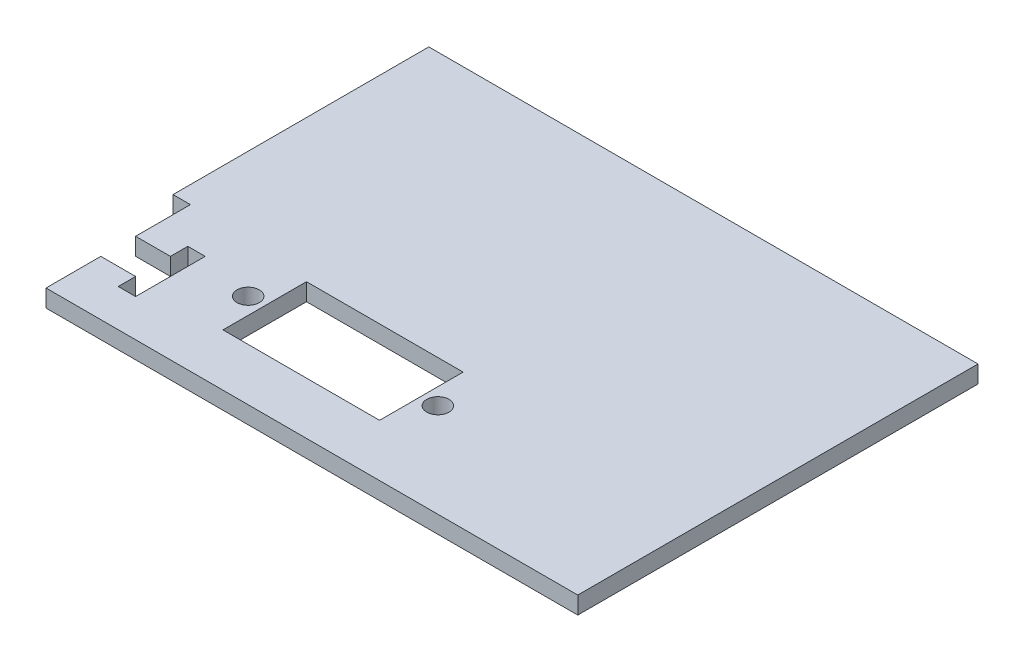
ISO-10303-21;
HEADER;
FILE_DESCRIPTION(('STEP AP214'),'2;1');
FILE_NAME('part.step','',(''),(''),'','','');
FILE_SCHEMA(('AUTOMOTIVE_DESIGN { 1 0 10303 214 1 1 1 1 }'));
ENDSEC;
DATA;
#1=APPLICATION_CONTEXT('core data for automotive mechanical design processes');
#2=APPLICATION_PROTOCOL_DEFINITION('international standard','automotive_design',2000,#1);
#3=PRODUCT_CONTEXT('',#1,'mechanical');
#4=PRODUCT('Part','Part','',(#3));
#5=PRODUCT_RELATED_PRODUCT_CATEGORY('part','',(#4));
#6=PRODUCT_DEFINITION_FORMATION('','',#4);
#7=PRODUCT_DEFINITION_CONTEXT('part definition',#1,'design');
#8=PRODUCT_DEFINITION('design','',#6,#7);
#9=PRODUCT_DEFINITION_SHAPE('','',#8);
#10=(LENGTH_UNIT() NAMED_UNIT(*) SI_UNIT(.MILLI.,.METRE.));
#11=(NAMED_UNIT(*) PLANE_ANGLE_UNIT() SI_UNIT($,.RADIAN.));
#12=(NAMED_UNIT(*) SI_UNIT($,.STERADIAN.) SOLID_ANGLE_UNIT());
#13=UNCERTAINTY_MEASURE_WITH_UNIT(LENGTH_MEASURE(1.E-05),#10,'distance_accuracy_value','');
#14=(GEOMETRIC_REPRESENTATION_CONTEXT(3) GLOBAL_UNCERTAINTY_ASSIGNED_CONTEXT((#13)) GLOBAL_UNIT_ASSIGNED_CONTEXT((#10,
#11,#12)) REPRESENTATION_CONTEXT('',''));
#15=CARTESIAN_POINT('',(0.,0.,0.));
#16=DIRECTION('',(0.,0.,1.));
#17=DIRECTION('',(1.,0.,0.));
#18=AXIS2_PLACEMENT_3D('',#15,#16,#17);
#19=CARTESIAN_POINT('',(0.,2.5,0.));
#20=DIRECTION('',(0.,-1.,0.));
#21=DIRECTION('',(0.,0.,-1.));
#22=AXIS2_PLACEMENT_3D('',#19,#20,#21);
#23=PLANE('',#22);
#24=DIRECTION('',(0.,0.,-1.));
#25=VECTOR('',#24,1.);
#26=CARTESIAN_POINT('',(-19.175,2.5,0.));
#27=LINE('',#26,#25);
#28=CARTESIAN_POINT('',(-19.175,2.5,32.125));
#29=VERTEX_POINT('',#28);
#30=CARTESIAN_POINT('',(-19.175,2.5,29.625));
#31=VERTEX_POINT('',#30);
#32=EDGE_CURVE('E288',#29,#31,#27,.T.);
#33=ORIENTED_EDGE('',*,*,#32,.T.);
#34=DIRECTION('',(1.,0.,0.));
#35=VECTOR('',#34,1.);
#36=CARTESIAN_POINT('',(0.,2.5,29.625));
#37=LINE('',#36,#35);
#38=CARTESIAN_POINT('',(-24.175,2.5,29.625));
#39=VERTEX_POINT('',#38);
#40=EDGE_CURVE('E291',#39,#31,#37,.T.);
#41=ORIENTED_EDGE('',*,*,#40,.F.);
#42=DIRECTION('',(0.,0.,-1.));
#43=VECTOR('',#42,1.);
#44=CARTESIAN_POINT('',(-24.175,2.5,37.5));
#45=LINE('',#44,#43);
#46=CARTESIAN_POINT('',(-24.175,2.5,37.5));
#47=VERTEX_POINT('',#46);
#48=EDGE_CURVE('E197',#47,#39,#45,.T.);
#49=ORIENTED_EDGE('',*,*,#48,.F.);
#50=DIRECTION('',(-1.,0.,0.));
#51=VECTOR('',#50,1.);
#52=CARTESIAN_POINT('',(-40.,2.5,37.5));
#53=LINE('',#52,#51);
#54=CARTESIAN_POINT('',(52.225,2.5,37.5));
#55=VERTEX_POINT('',#54);
#56=EDGE_CURVE('E201',#55,#47,#53,.T.);
#57=ORIENTED_EDGE('',*,*,#56,.F.);
#58=DIRECTION('',(0.,0.,1.));
#59=VECTOR('',#58,1.);
#60=CARTESIAN_POINT('',(52.225,2.5,-20.));
#61=LINE('',#60,#59);
#62=CARTESIAN_POINT('',(52.225,2.5,-20.));
#63=VERTEX_POINT('',#62);
#64=EDGE_CURVE('E331',#63,#55,#61,.T.);
#65=ORIENTED_EDGE('',*,*,#64,.F.);
#66=DIRECTION('',(1.,0.,0.));
#67=VECTOR('',#66,1.);
#68=CARTESIAN_POINT('',(-40.,2.5,-20.));
#69=LINE('',#68,#67);
#70=CARTESIAN_POINT('',(-26.675,2.5,-20.));
#71=VERTEX_POINT('',#70);
#72=EDGE_CURVE('E196',#71,#63,#69,.T.);
#73=ORIENTED_EDGE('',*,*,#72,.F.);
#74=DIRECTION('',(0.,0.,-1.));
#75=VECTOR('',#74,1.);
#76=CARTESIAN_POINT('',(-26.675,2.5,-20.));
#77=LINE('',#76,#75);
#78=CARTESIAN_POINT('',(-26.675,2.5,16.75));
#79=VERTEX_POINT('',#78);
#80=EDGE_CURVE('E187',#79,#71,#77,.T.);
#81=ORIENTED_EDGE('',*,*,#80,.F.);
#82=DIRECTION('',(-1.,0.,0.));
#83=VECTOR('',#82,1.);
#84=CARTESIAN_POINT('',(-24.175,2.5,16.75));
#85=LINE('',#84,#83);
#86=CARTESIAN_POINT('',(-24.175,2.5,16.75));
#87=VERTEX_POINT('',#86);
#88=EDGE_CURVE('E168',#87,#79,#85,.T.);
#89=ORIENTED_EDGE('',*,*,#88,.F.);
#90=CARTESIAN_POINT('',(-24.175,2.5,24.625));
#91=VERTEX_POINT('',#90);
#92=EDGE_CURVE('E189',#91,#87,#45,.T.);
#93=ORIENTED_EDGE('',*,*,#92,.F.);
#94=DIRECTION('',(1.,0.,0.));
#95=VECTOR('',#94,1.);
#96=CARTESIAN_POINT('',(0.,2.5,24.625));
#97=LINE('',#96,#95);
#98=CARTESIAN_POINT('',(-19.175,2.5,24.625));
#99=VERTEX_POINT('',#98);
#100=EDGE_CURVE('E312',#91,#99,#97,.T.);
#101=ORIENTED_EDGE('',*,*,#100,.T.);
#102=CARTESIAN_POINT('',(-19.175,2.5,22.125));
#103=VERTEX_POINT('',#102);
#104=EDGE_CURVE('E298',#99,#103,#27,.T.);
#105=ORIENTED_EDGE('',*,*,#104,.T.);
#106=DIRECTION('',(-1.,0.,0.));
#107=VECTOR('',#106,1.);
#108=CARTESIAN_POINT('',(0.,2.5,22.125));
#109=LINE('',#108,#107);
#110=CARTESIAN_POINT('',(-16.675,2.5,22.125));
#111=VERTEX_POINT('',#110);
#112=EDGE_CURVE('E357',#111,#103,#109,.T.);
#113=ORIENTED_EDGE('',*,*,#112,.F.);
#114=DIRECTION('',(0.,0.,-1.));
#115=VECTOR('',#114,1.);
#116=CARTESIAN_POINT('',(-16.675,2.5,0.));
#117=LINE('',#116,#115);
#118=CARTESIAN_POINT('',(-16.675,2.5,32.125));
#119=VERTEX_POINT('',#118);
#120=EDGE_CURVE('E361',#119,#111,#117,.T.);
#121=ORIENTED_EDGE('',*,*,#120,.F.);
#122=DIRECTION('',(1.,0.,0.));
#123=VECTOR('',#122,1.);
#124=CARTESIAN_POINT('',(0.,2.5,32.125));
#125=LINE('',#124,#123);
#126=EDGE_CURVE('E294',#29,#119,#125,.T.);
#127=ORIENTED_EDGE('',*,*,#126,.F.);
#128=EDGE_LOOP('',(#33,#41,#49,#57,#65,#73,#81,#89,#93,#101,#105,#113,#121,#127));
#129=FACE_BOUND('',#128,.T.);
#130=DIRECTION('',(-1.,0.,0.));
#131=VECTOR('',#130,1.);
#132=CARTESIAN_POINT('',(40.,2.5,30.));
#133=LINE('',#132,#131);
#134=CARTESIAN_POINT('',(16.25,2.5,30.));
#135=VERTEX_POINT('',#134);
#136=CARTESIAN_POINT('',(-6.24999999999999,2.5,30.));
#137=VERTEX_POINT('',#136);
#138=EDGE_CURVE('E206',#135,#137,#133,.T.);
#139=ORIENTED_EDGE('',*,*,#138,.T.);
#140=DIRECTION('',(0.,0.,-1.));
#141=VECTOR('',#140,1.);
#142=CARTESIAN_POINT('',(-6.24999999999999,2.5,0.));
#143=LINE('',#142,#141);
#144=CARTESIAN_POINT('',(-6.24999999999999,2.5,18.));
#145=VERTEX_POINT('',#144);
#146=EDGE_CURVE('E226',#137,#145,#143,.T.);
#147=ORIENTED_EDGE('',*,*,#146,.T.);
#148=DIRECTION('',(-1.,0.,0.));
#149=VECTOR('',#148,1.);
#150=CARTESIAN_POINT('',(0.,2.5,18.));
#151=LINE('',#150,#149);
#152=CARTESIAN_POINT('',(16.25,2.5,18.));
#153=VERTEX_POINT('',#152);
#154=EDGE_CURVE('E223',#153,#145,#151,.T.);
#155=ORIENTED_EDGE('',*,*,#154,.F.);
#156=DIRECTION('',(0.,0.,-1.));
#157=VECTOR('',#156,1.);
#158=CARTESIAN_POINT('',(16.25,2.5,0.));
#159=LINE('',#158,#157);
#160=EDGE_CURVE('E218',#135,#153,#159,.T.);
#161=ORIENTED_EDGE('',*,*,#160,.F.);
#162=EDGE_LOOP('',(#139,#147,#155,#161));
#163=FACE_BOUND('',#162,.T.);
#164=CARTESIAN_POINT('',(-8.625,2.5,24.));
#165=DIRECTION('',(0.,1.,0.));
#166=DIRECTION('',(0.,0.,1.));
#167=AXIS2_PLACEMENT_3D('',#164,#165,#166);
#168=CIRCLE('',#167,1.6);
#169=CARTESIAN_POINT('',(-8.625,2.5,25.6));
#170=VERTEX_POINT('',#169);
#171=EDGE_CURVE('E215',#170,#170,#168,.T.);
#172=ORIENTED_EDGE('',*,*,#171,.F.);
#173=EDGE_LOOP('',(#172));
#174=FACE_BOUND('',#173,.T.);
#175=CARTESIAN_POINT('',(18.625,2.5,24.));
#176=DIRECTION('',(0.,1.,0.));
#177=DIRECTION('',(0.,0.,1.));
#178=AXIS2_PLACEMENT_3D('',#175,#176,#177);
#179=CIRCLE('',#178,1.6);
#180=CARTESIAN_POINT('',(18.625,2.5,25.6));
#181=VERTEX_POINT('',#180);
#182=EDGE_CURVE('E214',#181,#181,#179,.T.);
#183=ORIENTED_EDGE('',*,*,#182,.F.);
#184=EDGE_LOOP('',(#183));
#185=FACE_BOUND('',#184,.T.);
#186=ADVANCED_FACE('F34',(#129,#163,#174,#185),#23,.F.);
#187=CARTESIAN_POINT('',(0.,0.,0.));
#188=DIRECTION('',(0.,-1.,0.));
#189=DIRECTION('',(0.,0.,-1.));
#190=AXIS2_PLACEMENT_3D('',#187,#188,#189);
#191=PLANE('',#190);
#192=DIRECTION('',(-1.,0.,0.));
#193=VECTOR('',#192,1.);
#194=CARTESIAN_POINT('',(-24.175,0.,16.75));
#195=LINE('',#194,#193);
#196=CARTESIAN_POINT('',(-24.175,0.,16.75));
#197=VERTEX_POINT('',#196);
#198=CARTESIAN_POINT('',(-26.675,0.,16.75));
#199=VERTEX_POINT('',#198);
#200=EDGE_CURVE('E165',#197,#199,#195,.T.);
#201=ORIENTED_EDGE('',*,*,#200,.T.);
#202=DIRECTION('',(0.,0.,-1.));
#203=VECTOR('',#202,1.);
#204=CARTESIAN_POINT('',(-26.675,0.,-20.));
#205=LINE('',#204,#203);
#206=CARTESIAN_POINT('',(-26.675,0.,-20.));
#207=VERTEX_POINT('',#206);
#208=EDGE_CURVE('E178',#199,#207,#205,.T.);
#209=ORIENTED_EDGE('',*,*,#208,.T.);
#210=DIRECTION('',(1.,0.,0.));
#211=VECTOR('',#210,1.);
#212=CARTESIAN_POINT('',(-40.,0.,-20.));
#213=LINE('',#212,#211);
#214=CARTESIAN_POINT('',(52.225,0.,-20.));
#215=VERTEX_POINT('',#214);
#216=EDGE_CURVE('E199',#207,#215,#213,.T.);
#217=ORIENTED_EDGE('',*,*,#216,.T.);
#218=DIRECTION('',(0.,0.,1.));
#219=VECTOR('',#218,1.);
#220=CARTESIAN_POINT('',(52.225,0.,-20.));
#221=LINE('',#220,#219);
#222=CARTESIAN_POINT('',(52.225,0.,37.5));
#223=VERTEX_POINT('',#222);
#224=EDGE_CURVE('E59',#215,#223,#221,.T.);
#225=ORIENTED_EDGE('',*,*,#224,.T.);
#226=DIRECTION('',(1.,0.,0.));
#227=VECTOR('',#226,1.);
#228=CARTESIAN_POINT('',(-40.,0.,37.5));
#229=LINE('',#228,#227);
#230=CARTESIAN_POINT('',(-24.175,0.,37.5));
#231=VERTEX_POINT('',#230);
#232=EDGE_CURVE('E204',#231,#223,#229,.T.);
#233=ORIENTED_EDGE('',*,*,#232,.F.);
#234=DIRECTION('',(0.,0.,-1.));
#235=VECTOR('',#234,1.);
#236=CARTESIAN_POINT('',(-24.175,0.,16.75));
#237=LINE('',#236,#235);
#238=CARTESIAN_POINT('',(-24.175,0.,29.625));
#239=VERTEX_POINT('',#238);
#240=EDGE_CURVE('E346',#231,#239,#237,.T.);
#241=ORIENTED_EDGE('',*,*,#240,.T.);
#242=DIRECTION('',(1.,0.,0.));
#243=VECTOR('',#242,1.);
#244=CARTESIAN_POINT('',(0.,0.,29.625));
#245=LINE('',#244,#243);
#246=CARTESIAN_POINT('',(-19.175,0.,29.625));
#247=VERTEX_POINT('',#246);
#248=EDGE_CURVE('E330',#239,#247,#245,.T.);
#249=ORIENTED_EDGE('',*,*,#248,.T.);
#250=DIRECTION('',(0.,0.,-1.));
#251=VECTOR('',#250,1.);
#252=CARTESIAN_POINT('',(-19.175,0.,0.));
#253=LINE('',#252,#251);
#254=CARTESIAN_POINT('',(-19.175,0.,32.125));
#255=VERTEX_POINT('',#254);
#256=EDGE_CURVE('E334',#255,#247,#253,.T.);
#257=ORIENTED_EDGE('',*,*,#256,.F.);
#258=DIRECTION('',(1.,0.,0.));
#259=VECTOR('',#258,1.);
#260=CARTESIAN_POINT('',(0.,0.,32.125));
#261=LINE('',#260,#259);
#262=CARTESIAN_POINT('',(-16.675,0.,32.125));
#263=VERTEX_POINT('',#262);
#264=EDGE_CURVE('E51',#255,#263,#261,.T.);
#265=ORIENTED_EDGE('',*,*,#264,.T.);
#266=DIRECTION('',(0.,0.,-1.));
#267=VECTOR('',#266,1.);
#268=CARTESIAN_POINT('',(-16.675,0.,0.));
#269=LINE('',#268,#267);
#270=CARTESIAN_POINT('',(-16.675,0.,22.125));
#271=VERTEX_POINT('',#270);
#272=EDGE_CURVE('E323',#263,#271,#269,.T.);
#273=ORIENTED_EDGE('',*,*,#272,.T.);
#274=DIRECTION('',(-1.,0.,0.));
#275=VECTOR('',#274,1.);
#276=CARTESIAN_POINT('',(0.,0.,22.125));
#277=LINE('',#276,#275);
#278=CARTESIAN_POINT('',(-19.175,0.,22.125));
#279=VERTEX_POINT('',#278);
#280=EDGE_CURVE('E304',#271,#279,#277,.T.);
#281=ORIENTED_EDGE('',*,*,#280,.T.);
#282=DIRECTION('',(0.,0.,-1.));
#283=VECTOR('',#282,1.);
#284=CARTESIAN_POINT('',(-19.175,0.,0.));
#285=LINE('',#284,#283);
#286=CARTESIAN_POINT('',(-19.175,0.,24.625));
#287=VERTEX_POINT('',#286);
#288=EDGE_CURVE('E374',#287,#279,#285,.T.);
#289=ORIENTED_EDGE('',*,*,#288,.F.);
#290=DIRECTION('',(1.,0.,0.));
#291=VECTOR('',#290,1.);
#292=CARTESIAN_POINT('',(0.,0.,24.625));
#293=LINE('',#292,#291);
#294=CARTESIAN_POINT('',(-24.175,0.,24.625));
#295=VERTEX_POINT('',#294);
#296=EDGE_CURVE('E360',#295,#287,#293,.T.);
#297=ORIENTED_EDGE('',*,*,#296,.F.);
#298=EDGE_CURVE('E181',#295,#197,#237,.T.);
#299=ORIENTED_EDGE('',*,*,#298,.T.);
#300=EDGE_LOOP('',(#201,#209,#217,#225,#233,#241,#249,#257,#265,#273,#281,#289,#297,#299));
#301=FACE_BOUND('',#300,.T.);
#302=CARTESIAN_POINT('',(18.625,0.,24.));
#303=DIRECTION('',(0.,-1.,0.));
#304=DIRECTION('',(0.,0.,-1.));
#305=AXIS2_PLACEMENT_3D('',#302,#303,#304);
#306=CIRCLE('',#305,1.6);
#307=CARTESIAN_POINT('',(18.625,0.,25.6));
#308=VERTEX_POINT('',#307);
#309=EDGE_CURVE('E38',#308,#308,#306,.T.);
#310=ORIENTED_EDGE('',*,*,#309,.F.);
#311=EDGE_LOOP('',(#310));
#312=FACE_BOUND('',#311,.T.);
#313=CARTESIAN_POINT('',(-8.625,0.,24.));
#314=DIRECTION('',(0.,-1.,0.));
#315=DIRECTION('',(0.,0.,-1.));
#316=AXIS2_PLACEMENT_3D('',#313,#314,#315);
#317=CIRCLE('',#316,1.6);
#318=CARTESIAN_POINT('',(-8.625,0.,25.6));
#319=VERTEX_POINT('',#318);
#320=EDGE_CURVE('E233',#319,#319,#317,.T.);
#321=ORIENTED_EDGE('',*,*,#320,.F.);
#322=EDGE_LOOP('',(#321));
#323=FACE_BOUND('',#322,.T.);
#324=DIRECTION('',(1.,0.,0.));
#325=VECTOR('',#324,1.);
#326=CARTESIAN_POINT('',(0.,0.,18.));
#327=LINE('',#326,#325);
#328=CARTESIAN_POINT('',(-6.24999999999999,0.,18.));
#329=VERTEX_POINT('',#328);
#330=CARTESIAN_POINT('',(16.25,0.,18.));
#331=VERTEX_POINT('',#330);
#332=EDGE_CURVE('E43',#329,#331,#327,.T.);
#333=ORIENTED_EDGE('',*,*,#332,.F.);
#334=DIRECTION('',(0.,0.,1.));
#335=VECTOR('',#334,1.);
#336=CARTESIAN_POINT('',(-6.24999999999999,0.,0.));
#337=LINE('',#336,#335);
#338=CARTESIAN_POINT('',(-6.24999999999999,0.,30.));
#339=VERTEX_POINT('',#338);
#340=EDGE_CURVE('E11',#329,#339,#337,.T.);
#341=ORIENTED_EDGE('',*,*,#340,.T.);
#342=DIRECTION('',(-1.,0.,0.));
#343=VECTOR('',#342,1.);
#344=CARTESIAN_POINT('',(40.,0.,30.));
#345=LINE('',#344,#343);
#346=CARTESIAN_POINT('',(16.25,0.,30.));
#347=VERTEX_POINT('',#346);
#348=EDGE_CURVE('E211',#347,#339,#345,.T.);
#349=ORIENTED_EDGE('',*,*,#348,.F.);
#350=DIRECTION('',(0.,0.,1.));
#351=VECTOR('',#350,1.);
#352=CARTESIAN_POINT('',(16.25,0.,0.));
#353=LINE('',#352,#351);
#354=EDGE_CURVE('E240',#331,#347,#353,.T.);
#355=ORIENTED_EDGE('',*,*,#354,.F.);
#356=EDGE_LOOP('',(#333,#341,#349,#355));
#357=FACE_BOUND('',#356,.T.);
#358=ADVANCED_FACE('F36',(#301,#312,#323,#357),#191,.T.);
#359=CARTESIAN_POINT('',(-6.24999999999999,-1.2E-05,0.));
#360=DIRECTION('',(1.,0.,0.));
#361=DIRECTION('',(0.,0.,-1.));
#362=AXIS2_PLACEMENT_3D('',#359,#360,#361);
#363=PLANE('',#362);
#364=DIRECTION('',(0.,1.,0.));
#365=VECTOR('',#364,1.);
#366=CARTESIAN_POINT('',(-6.24999999999999,-1.2E-05,18.));
#367=LINE('',#366,#365);
#368=EDGE_CURVE('E234',#329,#145,#367,.T.);
#369=ORIENTED_EDGE('',*,*,#368,.T.);
#370=ORIENTED_EDGE('',*,*,#146,.F.);
#371=DIRECTION('',(0.,1.,0.));
#372=VECTOR('',#371,1.);
#373=CARTESIAN_POINT('',(-6.24999999999999,-1.2E-05,30.));
#374=LINE('',#373,#372);
#375=EDGE_CURVE('E230',#339,#137,#374,.T.);
#376=ORIENTED_EDGE('',*,*,#375,.F.);
#377=ORIENTED_EDGE('',*,*,#340,.F.);
#378=EDGE_LOOP('',(#369,#370,#376,#377));
#379=FACE_BOUND('',#378,.T.);
#380=ADVANCED_FACE('F254',(#379),#363,.T.);
#381=CARTESIAN_POINT('',(0.,-1.2E-05,18.));
#382=DIRECTION('',(0.,0.,-1.));
#383=DIRECTION('',(-1.,0.,0.));
#384=AXIS2_PLACEMENT_3D('',#381,#382,#383);
#385=PLANE('',#384);
#386=ORIENTED_EDGE('',*,*,#332,.T.);
#387=DIRECTION('',(0.,1.,0.));
#388=VECTOR('',#387,1.);
#389=CARTESIAN_POINT('',(16.25,-1.2E-05,18.));
#390=LINE('',#389,#388);
#391=EDGE_CURVE('E236',#331,#153,#390,.T.);
#392=ORIENTED_EDGE('',*,*,#391,.T.);
#393=ORIENTED_EDGE('',*,*,#154,.T.);
#394=ORIENTED_EDGE('',*,*,#368,.F.);
#395=EDGE_LOOP('',(#386,#392,#393,#394));
#396=FACE_BOUND('',#395,.T.);
#397=ADVANCED_FACE('F261',(#396),#385,.F.);
#398=CARTESIAN_POINT('',(16.25,-1.2E-05,0.));
#399=DIRECTION('',(1.,0.,0.));
#400=DIRECTION('',(0.,0.,-1.));
#401=AXIS2_PLACEMENT_3D('',#398,#399,#400);
#402=PLANE('',#401);
#403=ORIENTED_EDGE('',*,*,#354,.T.);
#404=DIRECTION('',(0.,1.,0.));
#405=VECTOR('',#404,1.);
#406=CARTESIAN_POINT('',(16.25,-1.2E-05,30.));
#407=LINE('',#406,#405);
#408=EDGE_CURVE('E229',#347,#135,#407,.T.);
#409=ORIENTED_EDGE('',*,*,#408,.T.);
#410=ORIENTED_EDGE('',*,*,#160,.T.);
#411=ORIENTED_EDGE('',*,*,#391,.F.);
#412=EDGE_LOOP('',(#403,#409,#410,#411));
#413=FACE_BOUND('',#412,.T.);
#414=ADVANCED_FACE('F270',(#413),#402,.F.);
#415=CARTESIAN_POINT('',(-8.625,-1.2E-05,24.));
#416=DIRECTION('',(0.,1.,0.));
#417=DIRECTION('',(0.,0.,1.));
#418=AXIS2_PLACEMENT_3D('',#415,#416,#417);
#419=CYLINDRICAL_SURFACE('',#418,1.6);
#420=CARTESIAN_POINT('',(-8.625,0.,25.6));
#421=CARTESIAN_POINT('',(-8.625,0.0260416666666666,25.6));
#422=CARTESIAN_POINT('',(-8.625,0.0520833333333333,25.6));
#423=CARTESIAN_POINT('',(-8.625,0.104166666666667,25.6));
#424=CARTESIAN_POINT('',(-8.625,0.130208333333333,25.6));
#425=CARTESIAN_POINT('',(-8.625,0.182291666666667,25.6));
#426=CARTESIAN_POINT('',(-8.625,0.208333333333333,25.6));
#427=CARTESIAN_POINT('',(-8.625,0.260416666666667,25.6));
#428=CARTESIAN_POINT('',(-8.625,0.286458333333333,25.6));
#429=CARTESIAN_POINT('',(-8.625,0.338541666666667,25.6));
#430=CARTESIAN_POINT('',(-8.625,0.364583333333333,25.6));
#431=CARTESIAN_POINT('',(-8.625,0.416666666666667,25.6));
#432=CARTESIAN_POINT('',(-8.625,0.442708333333333,25.6));
#433=CARTESIAN_POINT('',(-8.625,0.494791666666667,25.6));
#434=CARTESIAN_POINT('',(-8.625,0.520833333333333,25.6));
#435=CARTESIAN_POINT('',(-8.625,0.572916666666667,25.6));
#436=CARTESIAN_POINT('',(-8.625,0.598958333333333,25.6));
#437=CARTESIAN_POINT('',(-8.625,0.651041666666667,25.6));
#438=CARTESIAN_POINT('',(-8.625,0.677083333333333,25.6));
#439=CARTESIAN_POINT('',(-8.625,0.729166666666667,25.6));
#440=CARTESIAN_POINT('',(-8.625,0.755208333333333,25.6));
#441=CARTESIAN_POINT('',(-8.625,0.807291666666667,25.6));
#442=CARTESIAN_POINT('',(-8.625,0.833333333333333,25.6));
#443=CARTESIAN_POINT('',(-8.625,0.885416666666667,25.6));
#444=CARTESIAN_POINT('',(-8.625,0.911458333333333,25.6));
#445=CARTESIAN_POINT('',(-8.625,0.963541666666667,25.6));
#446=CARTESIAN_POINT('',(-8.625,0.989583333333333,25.6));
#447=CARTESIAN_POINT('',(-8.625,1.04166666666667,25.6));
#448=CARTESIAN_POINT('',(-8.625,1.06770833333333,25.6));
#449=CARTESIAN_POINT('',(-8.625,1.11979166666667,25.6));
#450=CARTESIAN_POINT('',(-8.625,1.14583333333333,25.6));
#451=CARTESIAN_POINT('',(-8.625,1.19791666666667,25.6));
#452=CARTESIAN_POINT('',(-8.625,1.22395833333333,25.6));
#453=CARTESIAN_POINT('',(-8.625,1.27604166666667,25.6));
#454=CARTESIAN_POINT('',(-8.625,1.30208333333333,25.6));
#455=CARTESIAN_POINT('',(-8.625,1.35416666666667,25.6));
#456=CARTESIAN_POINT('',(-8.625,1.38020833333333,25.6));
#457=CARTESIAN_POINT('',(-8.625,1.43229166666667,25.6));
#458=CARTESIAN_POINT('',(-8.625,1.45833333333333,25.6));
#459=CARTESIAN_POINT('',(-8.625,1.51041666666667,25.6));
#460=CARTESIAN_POINT('',(-8.625,1.53645833333333,25.6));
#461=CARTESIAN_POINT('',(-8.625,1.58854166666667,25.6));
#462=CARTESIAN_POINT('',(-8.625,1.61458333333333,25.6));
#463=CARTESIAN_POINT('',(-8.625,1.66666666666667,25.6));
#464=CARTESIAN_POINT('',(-8.625,1.69270833333333,25.6));
#465=CARTESIAN_POINT('',(-8.625,1.74479166666667,25.6));
#466=CARTESIAN_POINT('',(-8.625,1.77083333333333,25.6));
#467=CARTESIAN_POINT('',(-8.625,1.82291666666667,25.6));
#468=CARTESIAN_POINT('',(-8.625,1.84895833333333,25.6));
#469=CARTESIAN_POINT('',(-8.625,1.90104166666667,25.6));
#470=CARTESIAN_POINT('',(-8.625,1.92708333333333,25.6));
#471=CARTESIAN_POINT('',(-8.625,1.97916666666667,25.6));
#472=CARTESIAN_POINT('',(-8.625,2.00520833333333,25.6));
#473=CARTESIAN_POINT('',(-8.625,2.05729166666667,25.6));
#474=CARTESIAN_POINT('',(-8.625,2.08333333333333,25.6));
#475=CARTESIAN_POINT('',(-8.625,2.13541666666667,25.6));
#476=CARTESIAN_POINT('',(-8.625,2.16145833333333,25.6));
#477=CARTESIAN_POINT('',(-8.625,2.21354166666667,25.6));
#478=CARTESIAN_POINT('',(-8.625,2.23958333333333,25.6));
#479=CARTESIAN_POINT('',(-8.625,2.29166666666667,25.6));
#480=CARTESIAN_POINT('',(-8.625,2.31770833333333,25.6));
#481=CARTESIAN_POINT('',(-8.625,2.36979166666667,25.6));
#482=CARTESIAN_POINT('',(-8.625,2.39583333333333,25.6));
#483=CARTESIAN_POINT('',(-8.625,2.44791666666667,25.6));
#484=CARTESIAN_POINT('',(-8.625,2.47395833333333,25.6));
#485=CARTESIAN_POINT('',(-8.625,2.5,25.6));
#486=B_SPLINE_CURVE_WITH_KNOTS('',3,(#420,#421,#422,#423,#424,#425,#426,#427,#428,#429,#430,
#431,#432,#433,#434,#435,#436,#437,#438,#439,#440,#441,#442,#443,#444,#445,#446,#447,#448,#449,
#450,#451,#452,#453,#454,#455,#456,#457,#458,#459,#460,#461,#462,#463,#464,#465,#466,#467,#468,
#469,#470,#471,#472,#473,#474,#475,#476,#477,#478,#479,#480,#481,#482,#483,#484,#485),
.UNSPECIFIED.,.F.,.F.,(4,2,2,2,2,2,2,2,2,2,2,2,2,2,2,2,2,2,2,2,2,2,2,2,2,2,2,2,2,2,2,2,4),(0.,
0.078125,0.15625,0.234375,0.3125,0.390625,0.46875,0.546875,0.625,0.703125,0.78125,0.859375,
0.9375,1.015625,1.09375,1.171875,1.25,1.328125,1.40625,1.484375,1.5625,1.640625,1.71875,
1.796875,1.875,1.953125,2.03125,2.109375,2.1875,2.265625,2.34375,2.421875,2.5),.UNSPECIFIED.);
#487=EDGE_CURVE('BSEAM272',#319,#170,#486,.T.);
#488=ORIENTED_EDGE('',*,*,#320,.T.);
#489=ORIENTED_EDGE('',*,*,#171,.T.);
#490=ORIENTED_EDGE('',*,*,#487,.T.);
#491=ORIENTED_EDGE('',*,*,#487,.F.);
#492=EDGE_LOOP('',(#488,#490,#489,#491));
#493=FACE_BOUND('',#492,.T.);
#494=ADVANCED_FACE('F272',(#493),#419,.F.);
#495=CARTESIAN_POINT('',(18.625,-1.2E-05,24.));
#496=DIRECTION('',(0.,1.,0.));
#497=DIRECTION('',(0.,0.,1.));
#498=AXIS2_PLACEMENT_3D('',#495,#496,#497);
#499=CYLINDRICAL_SURFACE('',#498,1.6);
#500=CARTESIAN_POINT('',(18.625,0.,25.6));
#501=CARTESIAN_POINT('',(18.625,0.0260416666666666,25.6));
#502=CARTESIAN_POINT('',(18.625,0.0520833333333333,25.6));
#503=CARTESIAN_POINT('',(18.625,0.104166666666667,25.6));
#504=CARTESIAN_POINT('',(18.625,0.130208333333333,25.6));
#505=CARTESIAN_POINT('',(18.625,0.182291666666667,25.6));
#506=CARTESIAN_POINT('',(18.625,0.208333333333333,25.6));
#507=CARTESIAN_POINT('',(18.625,0.260416666666667,25.6));
#508=CARTESIAN_POINT('',(18.625,0.286458333333333,25.6));
#509=CARTESIAN_POINT('',(18.625,0.338541666666667,25.6));
#510=CARTESIAN_POINT('',(18.625,0.364583333333333,25.6));
#511=CARTESIAN_POINT('',(18.625,0.416666666666667,25.6));
#512=CARTESIAN_POINT('',(18.625,0.442708333333333,25.6));
#513=CARTESIAN_POINT('',(18.625,0.494791666666667,25.6));
#514=CARTESIAN_POINT('',(18.625,0.520833333333333,25.6));
#515=CARTESIAN_POINT('',(18.625,0.572916666666667,25.6));
#516=CARTESIAN_POINT('',(18.625,0.598958333333333,25.6));
#517=CARTESIAN_POINT('',(18.625,0.651041666666667,25.6));
#518=CARTESIAN_POINT('',(18.625,0.677083333333333,25.6));
#519=CARTESIAN_POINT('',(18.625,0.729166666666667,25.6));
#520=CARTESIAN_POINT('',(18.625,0.755208333333333,25.6));
#521=CARTESIAN_POINT('',(18.625,0.807291666666667,25.6));
#522=CARTESIAN_POINT('',(18.625,0.833333333333333,25.6));
#523=CARTESIAN_POINT('',(18.625,0.885416666666667,25.6));
#524=CARTESIAN_POINT('',(18.625,0.911458333333333,25.6));
#525=CARTESIAN_POINT('',(18.625,0.963541666666667,25.6));
#526=CARTESIAN_POINT('',(18.625,0.989583333333333,25.6));
#527=CARTESIAN_POINT('',(18.625,1.04166666666667,25.6));
#528=CARTESIAN_POINT('',(18.625,1.06770833333333,25.6));
#529=CARTESIAN_POINT('',(18.625,1.11979166666667,25.6));
#530=CARTESIAN_POINT('',(18.625,1.14583333333333,25.6));
#531=CARTESIAN_POINT('',(18.625,1.19791666666667,25.6));
#532=CARTESIAN_POINT('',(18.625,1.22395833333333,25.6));
#533=CARTESIAN_POINT('',(18.625,1.27604166666667,25.6));
#534=CARTESIAN_POINT('',(18.625,1.30208333333333,25.6));
#535=CARTESIAN_POINT('',(18.625,1.35416666666667,25.6));
#536=CARTESIAN_POINT('',(18.625,1.38020833333333,25.6));
#537=CARTESIAN_POINT('',(18.625,1.43229166666667,25.6));
#538=CARTESIAN_POINT('',(18.625,1.45833333333333,25.6));
#539=CARTESIAN_POINT('',(18.625,1.51041666666667,25.6));
#540=CARTESIAN_POINT('',(18.625,1.53645833333333,25.6));
#541=CARTESIAN_POINT('',(18.625,1.58854166666667,25.6));
#542=CARTESIAN_POINT('',(18.625,1.61458333333333,25.6));
#543=CARTESIAN_POINT('',(18.625,1.66666666666667,25.6));
#544=CARTESIAN_POINT('',(18.625,1.69270833333333,25.6));
#545=CARTESIAN_POINT('',(18.625,1.74479166666667,25.6));
#546=CARTESIAN_POINT('',(18.625,1.77083333333333,25.6));
#547=CARTESIAN_POINT('',(18.625,1.82291666666667,25.6));
#548=CARTESIAN_POINT('',(18.625,1.84895833333333,25.6));
#549=CARTESIAN_POINT('',(18.625,1.90104166666667,25.6));
#550=CARTESIAN_POINT('',(18.625,1.92708333333333,25.6));
#551=CARTESIAN_POINT('',(18.625,1.97916666666667,25.6));
#552=CARTESIAN_POINT('',(18.625,2.00520833333333,25.6));
#553=CARTESIAN_POINT('',(18.625,2.05729166666667,25.6));
#554=CARTESIAN_POINT('',(18.625,2.08333333333333,25.6));
#555=CARTESIAN_POINT('',(18.625,2.13541666666667,25.6));
#556=CARTESIAN_POINT('',(18.625,2.16145833333333,25.6));
#557=CARTESIAN_POINT('',(18.625,2.21354166666667,25.6));
#558=CARTESIAN_POINT('',(18.625,2.23958333333333,25.6));
#559=CARTESIAN_POINT('',(18.625,2.29166666666667,25.6));
#560=CARTESIAN_POINT('',(18.625,2.31770833333333,25.6));
#561=CARTESIAN_POINT('',(18.625,2.36979166666667,25.6));
#562=CARTESIAN_POINT('',(18.625,2.39583333333333,25.6));
#563=CARTESIAN_POINT('',(18.625,2.44791666666667,25.6));
#564=CARTESIAN_POINT('',(18.625,2.47395833333333,25.6));
#565=CARTESIAN_POINT('',(18.625,2.5,25.6));
#566=B_SPLINE_CURVE_WITH_KNOTS('',3,(#500,#501,#502,#503,#504,#505,#506,#507,#508,#509,#510,
#511,#512,#513,#514,#515,#516,#517,#518,#519,#520,#521,#522,#523,#524,#525,#526,#527,#528,#529,
#530,#531,#532,#533,#534,#535,#536,#537,#538,#539,#540,#541,#542,#543,#544,#545,#546,#547,#548,
#549,#550,#551,#552,#553,#554,#555,#556,#557,#558,#559,#560,#561,#562,#563,#564,#565),
.UNSPECIFIED.,.F.,.F.,(4,2,2,2,2,2,2,2,2,2,2,2,2,2,2,2,2,2,2,2,2,2,2,2,2,2,2,2,2,2,2,2,4),(0.,
0.078125,0.15625,0.234375,0.3125,0.390625,0.46875,0.546875,0.625,0.703125,0.78125,0.859375,
0.9375,1.015625,1.09375,1.171875,1.25,1.328125,1.40625,1.484375,1.5625,1.640625,1.71875,
1.796875,1.875,1.953125,2.03125,2.109375,2.1875,2.265625,2.34375,2.421875,2.5),.UNSPECIFIED.);
#567=EDGE_CURVE('BSEAM250',#308,#181,#566,.T.);
#568=ORIENTED_EDGE('',*,*,#309,.T.);
#569=ORIENTED_EDGE('',*,*,#182,.T.);
#570=ORIENTED_EDGE('',*,*,#567,.T.);
#571=ORIENTED_EDGE('',*,*,#567,.F.);
#572=EDGE_LOOP('',(#568,#570,#569,#571));
#573=FACE_BOUND('',#572,.T.);
#574=ADVANCED_FACE('F250',(#573),#499,.F.);
#575=CARTESIAN_POINT('',(40.,-80.1888396224811,30.));
#576=DIRECTION('',(0.,0.,-1.));
#577=DIRECTION('',(-1.,0.,0.));
#578=AXIS2_PLACEMENT_3D('',#575,#576,#577);
#579=PLANE('',#578);
#580=ORIENTED_EDGE('',*,*,#348,.T.);
#581=ORIENTED_EDGE('',*,*,#375,.T.);
#582=ORIENTED_EDGE('',*,*,#138,.F.);
#583=ORIENTED_EDGE('',*,*,#408,.F.);
#584=EDGE_LOOP('',(#580,#581,#582,#583));
#585=FACE_BOUND('',#584,.T.);
#586=ADVANCED_FACE('F265',(#585),#579,.T.);
#587=CARTESIAN_POINT('',(0.,0.,37.5));
#588=DIRECTION('',(0.,0.,1.));
#589=DIRECTION('',(1.,0.,0.));
#590=AXIS2_PLACEMENT_3D('',#587,#588,#589);
#591=PLANE('',#590);
#592=DIRECTION('',(0.,1.,0.));
#593=VECTOR('',#592,1.);
#594=CARTESIAN_POINT('',(-24.175,-20.9000598085269,37.5));
#595=LINE('',#594,#593);
#596=EDGE_CURVE('E172',#231,#47,#595,.T.);
#597=ORIENTED_EDGE('',*,*,#596,.F.);
#598=ORIENTED_EDGE('',*,*,#232,.T.);
#599=DIRECTION('',(0.,1.,0.));
#600=VECTOR('',#599,1.);
#601=CARTESIAN_POINT('',(52.225,-57.5782076831157,37.5));
#602=LINE('',#601,#600);
#603=EDGE_CURVE('E191',#223,#55,#602,.T.);
#604=ORIENTED_EDGE('',*,*,#603,.T.);
#605=ORIENTED_EDGE('',*,*,#56,.T.);
#606=EDGE_LOOP('',(#597,#598,#604,#605));
#607=FACE_BOUND('',#606,.T.);
#608=ADVANCED_FACE('F350',(#607),#591,.T.);
#609=CARTESIAN_POINT('',(-40.,0.,-20.));
#610=DIRECTION('',(0.,0.,1.));
#611=DIRECTION('',(1.,0.,0.));
#612=AXIS2_PLACEMENT_3D('',#609,#610,#611);
#613=PLANE('',#612);
#614=ORIENTED_EDGE('',*,*,#72,.T.);
#615=DIRECTION('',(0.,1.,0.));
#616=VECTOR('',#615,1.);
#617=CARTESIAN_POINT('',(52.225,-57.5782076831157,-20.));
#618=LINE('',#617,#616);
#619=EDGE_CURVE('E333',#215,#63,#618,.T.);
#620=ORIENTED_EDGE('',*,*,#619,.F.);
#621=ORIENTED_EDGE('',*,*,#216,.F.);
#622=DIRECTION('',(0.,1.,0.));
#623=VECTOR('',#622,1.);
#624=CARTESIAN_POINT('',(-26.675,-59.0237716941234,-20.));
#625=LINE('',#624,#623);
#626=EDGE_CURVE('E185',#207,#71,#625,.T.);
#627=ORIENTED_EDGE('',*,*,#626,.T.);
#628=EDGE_LOOP('',(#614,#620,#621,#627));
#629=FACE_BOUND('',#628,.T.);
#630=ADVANCED_FACE('F342',(#629),#613,.F.);
#631=CARTESIAN_POINT('',(-26.675,97.9000598085269,16.75));
#632=DIRECTION('',(1.,0.,0.));
#633=DIRECTION('',(0.,0.,-1.));
#634=AXIS2_PLACEMENT_3D('',#631,#632,#633);
#635=PLANE('',#634);
#636=ORIENTED_EDGE('',*,*,#208,.F.);
#637=DIRECTION('',(0.,1.,0.));
#638=VECTOR('',#637,1.);
#639=CARTESIAN_POINT('',(-26.675,-20.9000598085269,16.75));
#640=LINE('',#639,#638);
#641=EDGE_CURVE('E161',#199,#79,#640,.T.);
#642=ORIENTED_EDGE('',*,*,#641,.T.);
#643=ORIENTED_EDGE('',*,*,#80,.T.);
#644=ORIENTED_EDGE('',*,*,#626,.F.);
#645=EDGE_LOOP('',(#636,#642,#643,#644));
#646=FACE_BOUND('',#645,.T.);
#647=ADVANCED_FACE('F183',(#646),#635,.F.);
#648=CARTESIAN_POINT('',(52.225,-57.5782076831157,-20.));
#649=DIRECTION('',(-1.,0.,0.));
#650=DIRECTION('',(0.,0.,1.));
#651=AXIS2_PLACEMENT_3D('',#648,#649,#650);
#652=PLANE('',#651);
#653=ORIENTED_EDGE('',*,*,#619,.T.);
#654=ORIENTED_EDGE('',*,*,#64,.T.);
#655=ORIENTED_EDGE('',*,*,#603,.F.);
#656=ORIENTED_EDGE('',*,*,#224,.F.);
#657=EDGE_LOOP('',(#653,#654,#655,#656));
#658=FACE_BOUND('',#657,.T.);
#659=ADVANCED_FACE('F338',(#658),#652,.F.);
#660=CARTESIAN_POINT('',(0.,-12.5,29.625));
#661=DIRECTION('',(0.,0.,1.));
#662=DIRECTION('',(1.,0.,0.));
#663=AXIS2_PLACEMENT_3D('',#660,#661,#662);
#664=PLANE('',#663);
#665=DIRECTION('',(0.,1.,0.));
#666=VECTOR('',#665,1.);
#667=CARTESIAN_POINT('',(-24.175,-12.5,29.625));
#668=LINE('',#667,#666);
#669=EDGE_CURVE('E329',#239,#39,#668,.T.);
#670=ORIENTED_EDGE('',*,*,#669,.T.);
#671=ORIENTED_EDGE('',*,*,#40,.T.);
#672=DIRECTION('',(0.,1.,0.));
#673=VECTOR('',#672,1.);
#674=CARTESIAN_POINT('',(-19.175,-12.5,29.625));
#675=LINE('',#674,#673);
#676=EDGE_CURVE('E327',#247,#31,#675,.T.);
#677=ORIENTED_EDGE('',*,*,#676,.F.);
#678=ORIENTED_EDGE('',*,*,#248,.F.);
#679=EDGE_LOOP('',(#670,#671,#677,#678));
#680=FACE_BOUND('',#679,.T.);
#681=ADVANCED_FACE('F389',(#680),#664,.F.);
#682=CARTESIAN_POINT('',(0.,-12.5,24.625));
#683=DIRECTION('',(0.,0.,1.));
#684=DIRECTION('',(1.,0.,0.));
#685=AXIS2_PLACEMENT_3D('',#682,#683,#684);
#686=PLANE('',#685);
#687=ORIENTED_EDGE('',*,*,#296,.T.);
#688=DIRECTION('',(0.,1.,0.));
#689=VECTOR('',#688,1.);
#690=CARTESIAN_POINT('',(-19.175,-12.5,24.625));
#691=LINE('',#690,#689);
#692=EDGE_CURVE('E305',#287,#99,#691,.T.);
#693=ORIENTED_EDGE('',*,*,#692,.T.);
#694=ORIENTED_EDGE('',*,*,#100,.F.);
#695=DIRECTION('',(0.,1.,0.));
#696=VECTOR('',#695,1.);
#697=CARTESIAN_POINT('',(-24.175,-12.5,24.625));
#698=LINE('',#697,#696);
#699=EDGE_CURVE('E317',#295,#91,#698,.T.);
#700=ORIENTED_EDGE('',*,*,#699,.F.);
#701=EDGE_LOOP('',(#687,#693,#694,#700));
#702=FACE_BOUND('',#701,.T.);
#703=ADVANCED_FACE('F385',(#702),#686,.T.);
#704=CARTESIAN_POINT('',(-19.175,-12.5,0.));
#705=DIRECTION('',(1.,0.,0.));
#706=DIRECTION('',(0.,0.,-1.));
#707=AXIS2_PLACEMENT_3D('',#704,#705,#706);
#708=PLANE('',#707);
#709=ORIENTED_EDGE('',*,*,#288,.T.);
#710=DIRECTION('',(0.,1.,0.));
#711=VECTOR('',#710,1.);
#712=CARTESIAN_POINT('',(-19.175,-12.5,22.125));
#713=LINE('',#712,#711);
#714=EDGE_CURVE('E310',#279,#103,#713,.T.);
#715=ORIENTED_EDGE('',*,*,#714,.T.);
#716=ORIENTED_EDGE('',*,*,#104,.F.);
#717=ORIENTED_EDGE('',*,*,#692,.F.);
#718=EDGE_LOOP('',(#709,#715,#716,#717));
#719=FACE_BOUND('',#718,.T.);
#720=ADVANCED_FACE('F388',(#719),#708,.T.);
#721=CARTESIAN_POINT('',(0.,-12.5,22.125));
#722=DIRECTION('',(0.,0.,-1.));
#723=DIRECTION('',(-1.,0.,0.));
#724=AXIS2_PLACEMENT_3D('',#721,#722,#723);
#725=PLANE('',#724);
#726=DIRECTION('',(0.,1.,0.));
#727=VECTOR('',#726,1.);
#728=CARTESIAN_POINT('',(-16.675,-12.5,22.125));
#729=LINE('',#728,#727);
#730=EDGE_CURVE('E324',#271,#111,#729,.T.);
#731=ORIENTED_EDGE('',*,*,#730,.T.);
#732=ORIENTED_EDGE('',*,*,#112,.T.);
#733=ORIENTED_EDGE('',*,*,#714,.F.);
#734=ORIENTED_EDGE('',*,*,#280,.F.);
#735=EDGE_LOOP('',(#731,#732,#733,#734));
#736=FACE_BOUND('',#735,.T.);
#737=ADVANCED_FACE('F395',(#736),#725,.F.);
#738=CARTESIAN_POINT('',(-16.675,-12.5,0.));
#739=DIRECTION('',(1.,0.,0.));
#740=DIRECTION('',(0.,0.,-1.));
#741=AXIS2_PLACEMENT_3D('',#738,#739,#740);
#742=PLANE('',#741);
#743=DIRECTION('',(0.,1.,0.));
#744=VECTOR('',#743,1.);
#745=CARTESIAN_POINT('',(-16.675,-12.5,32.125));
#746=LINE('',#745,#744);
#747=EDGE_CURVE('E300',#263,#119,#746,.T.);
#748=ORIENTED_EDGE('',*,*,#747,.T.);
#749=ORIENTED_EDGE('',*,*,#120,.T.);
#750=ORIENTED_EDGE('',*,*,#730,.F.);
#751=ORIENTED_EDGE('',*,*,#272,.F.);
#752=EDGE_LOOP('',(#748,#749,#750,#751));
#753=FACE_BOUND('',#752,.T.);
#754=ADVANCED_FACE('F366',(#753),#742,.F.);
#755=CARTESIAN_POINT('',(0.,-12.5,32.125));
#756=DIRECTION('',(0.,0.,1.));
#757=DIRECTION('',(1.,0.,0.));
#758=AXIS2_PLACEMENT_3D('',#755,#756,#757);
#759=PLANE('',#758);
#760=DIRECTION('',(0.,1.,0.));
#761=VECTOR('',#760,1.);
#762=CARTESIAN_POINT('',(-19.175,-12.5,32.125));
#763=LINE('',#762,#761);
#764=EDGE_CURVE('E296',#255,#29,#763,.T.);
#765=ORIENTED_EDGE('',*,*,#764,.T.);
#766=ORIENTED_EDGE('',*,*,#126,.T.);
#767=ORIENTED_EDGE('',*,*,#747,.F.);
#768=ORIENTED_EDGE('',*,*,#264,.F.);
#769=EDGE_LOOP('',(#765,#766,#767,#768));
#770=FACE_BOUND('',#769,.T.);
#771=ADVANCED_FACE('F363',(#770),#759,.F.);
#772=ORIENTED_EDGE('',*,*,#256,.T.);
#773=ORIENTED_EDGE('',*,*,#676,.T.);
#774=ORIENTED_EDGE('',*,*,#32,.F.);
#775=ORIENTED_EDGE('',*,*,#764,.F.);
#776=EDGE_LOOP('',(#772,#773,#774,#775));
#777=FACE_BOUND('',#776,.T.);
#778=ADVANCED_FACE('F398',(#777),#708,.T.);
#779=CARTESIAN_POINT('',(-24.175,-20.9000598085269,16.75));
#780=DIRECTION('',(1.,0.,0.));
#781=DIRECTION('',(0.,0.,-1.));
#782=AXIS2_PLACEMENT_3D('',#779,#780,#781);
#783=PLANE('',#782);
#784=DIRECTION('',(0.,1.,0.));
#785=VECTOR('',#784,1.);
#786=CARTESIAN_POINT('',(-24.175,-20.9000598085269,16.75));
#787=LINE('',#786,#785);
#788=EDGE_CURVE('E355',#197,#87,#787,.T.);
#789=ORIENTED_EDGE('',*,*,#788,.F.);
#790=ORIENTED_EDGE('',*,*,#298,.F.);
#791=ORIENTED_EDGE('',*,*,#699,.T.);
#792=ORIENTED_EDGE('',*,*,#92,.T.);
#793=EDGE_LOOP('',(#789,#790,#791,#792));
#794=FACE_BOUND('',#793,.T.);
#795=ADVANCED_FACE('F383',(#794),#783,.F.);
#796=CARTESIAN_POINT('',(-24.175,-20.9000598085269,16.75));
#797=DIRECTION('',(0.,0.,-1.));
#798=DIRECTION('',(-1.,0.,0.));
#799=AXIS2_PLACEMENT_3D('',#796,#797,#798);
#800=PLANE('',#799);
#801=ORIENTED_EDGE('',*,*,#641,.F.);
#802=ORIENTED_EDGE('',*,*,#200,.F.);
#803=ORIENTED_EDGE('',*,*,#788,.T.);
#804=ORIENTED_EDGE('',*,*,#88,.T.);
#805=EDGE_LOOP('',(#801,#802,#803,#804));
#806=FACE_BOUND('',#805,.T.);
#807=ADVANCED_FACE('F163',(#806),#800,.F.);
#808=ORIENTED_EDGE('',*,*,#669,.F.);
#809=ORIENTED_EDGE('',*,*,#240,.F.);
#810=ORIENTED_EDGE('',*,*,#596,.T.);
#811=ORIENTED_EDGE('',*,*,#48,.T.);
#812=EDGE_LOOP('',(#808,#809,#810,#811));
#813=FACE_BOUND('',#812,.T.);
#814=ADVANCED_FACE('F480',(#813),#783,.F.);
#815=CLOSED_SHELL('',(#186,#358,#380,#397,#414,#494,#574,#586,#608,#630,#647,#659,#681,#703,
#720,#737,#754,#771,#778,#795,#807,#814));
#816=MANIFOLD_SOLID_BREP('B2',#815);
#817=ADVANCED_BREP_SHAPE_REPRESENTATION('',(#18,#816),#14);
#818=SHAPE_DEFINITION_REPRESENTATION(#9,#817);
ENDSEC;
END-ISO-10303-21;
